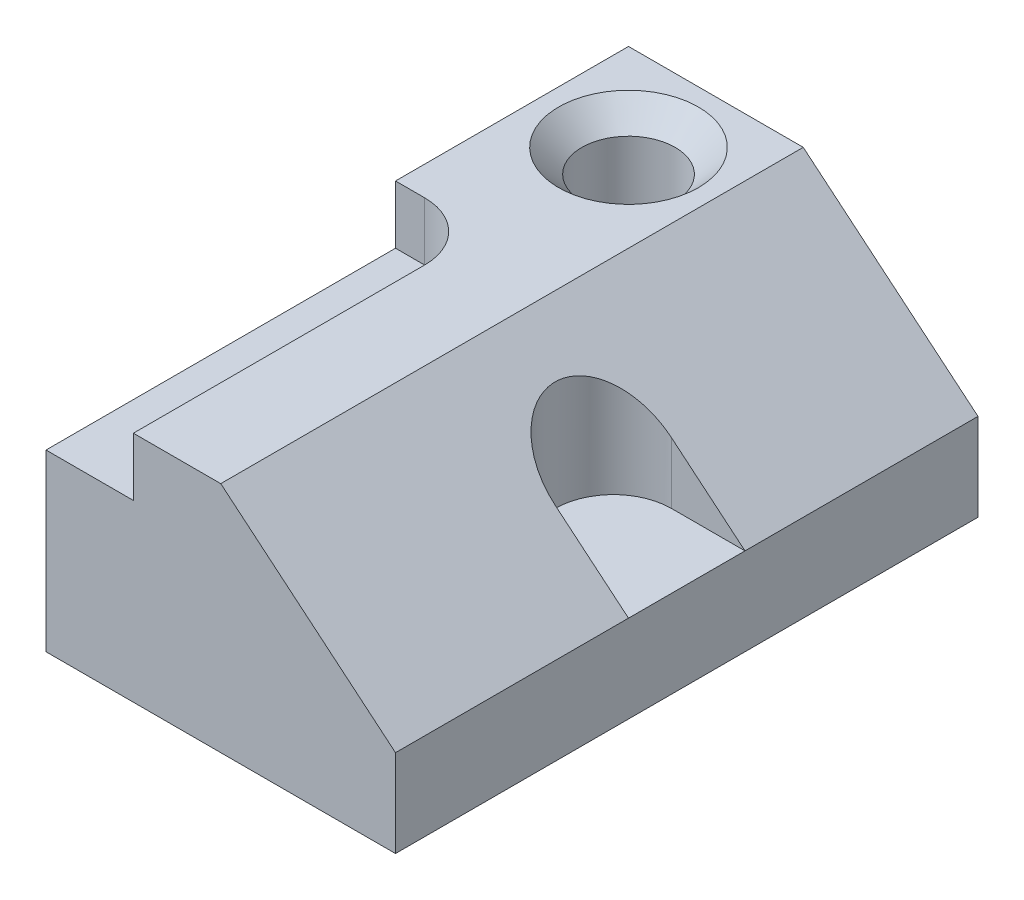
ISO-10303-21;
HEADER;
FILE_DESCRIPTION(('STEP AP214'),'2;1');
FILE_NAME('part.step','',(''),(''),'','','');
FILE_SCHEMA(('AUTOMOTIVE_DESIGN { 1 0 10303 214 1 1 1 1 }'));
ENDSEC;
DATA;
#1=APPLICATION_CONTEXT('core data for automotive mechanical design processes');
#2=APPLICATION_PROTOCOL_DEFINITION('international standard','automotive_design',2000,#1);
#3=PRODUCT_CONTEXT('',#1,'mechanical');
#4=PRODUCT('Part','Part','',(#3));
#5=PRODUCT_RELATED_PRODUCT_CATEGORY('part','',(#4));
#6=PRODUCT_DEFINITION_FORMATION('','',#4);
#7=PRODUCT_DEFINITION_CONTEXT('part definition',#1,'design');
#8=PRODUCT_DEFINITION('design','',#6,#7);
#9=PRODUCT_DEFINITION_SHAPE('','',#8);
#10=(LENGTH_UNIT() NAMED_UNIT(*) SI_UNIT(.MILLI.,.METRE.));
#11=(NAMED_UNIT(*) PLANE_ANGLE_UNIT() SI_UNIT($,.RADIAN.));
#12=(NAMED_UNIT(*) SI_UNIT($,.STERADIAN.) SOLID_ANGLE_UNIT());
#13=UNCERTAINTY_MEASURE_WITH_UNIT(LENGTH_MEASURE(1.E-05),#10,'distance_accuracy_value','');
#14=(GEOMETRIC_REPRESENTATION_CONTEXT(3) GLOBAL_UNCERTAINTY_ASSIGNED_CONTEXT((#13)) GLOBAL_UNIT_ASSIGNED_CONTEXT((#10,
#11,#12)) REPRESENTATION_CONTEXT('',''));
#15=CARTESIAN_POINT('',(0.,0.,0.));
#16=DIRECTION('',(0.,0.,1.));
#17=DIRECTION('',(1.,0.,0.));
#18=AXIS2_PLACEMENT_3D('',#15,#16,#17);
#19=CARTESIAN_POINT('',(6.35,38.1,63.5));
#20=DIRECTION('',(0.,-1.,0.));
#21=DIRECTION('',(1.,0.,0.));
#22=AXIS2_PLACEMENT_3D('',#19,#20,#21);
#23=CYLINDRICAL_SURFACE('',#22,12.7);
#24=DIRECTION('',(0.,1.,0.));
#25=VECTOR('',#24,1.);
#26=CARTESIAN_POINT('',(6.35,38.1,50.8));
#27=LINE('',#26,#25);
#28=CARTESIAN_POINT('',(6.35,38.1,50.8));
#29=VERTEX_POINT('',#28);
#30=CARTESIAN_POINT('',(6.35,50.8,50.8));
#31=VERTEX_POINT('',#30);
#32=EDGE_CURVE('E223',#29,#31,#27,.T.);
#33=ORIENTED_EDGE('',*,*,#32,.F.);
#34=CARTESIAN_POINT('',(6.35,38.1,63.5));
#35=DIRECTION('',(0.,-1.,0.));
#36=DIRECTION('',(1.,0.,0.));
#37=AXIS2_PLACEMENT_3D('',#34,#35,#36);
#38=CIRCLE('',#37,12.7);
#39=CARTESIAN_POINT('',(19.05,38.1,63.5));
#40=VERTEX_POINT('',#39);
#41=EDGE_CURVE('E89',#40,#29,#38,.F.);
#42=ORIENTED_EDGE('',*,*,#41,.F.);
#43=DIRECTION('',(0.,1.,0.));
#44=VECTOR('',#43,1.);
#45=CARTESIAN_POINT('',(19.05,38.1,63.5));
#46=LINE('',#45,#44);
#47=CARTESIAN_POINT('',(19.05,50.8,63.5));
#48=VERTEX_POINT('',#47);
#49=EDGE_CURVE('E227',#48,#40,#46,.F.);
#50=ORIENTED_EDGE('',*,*,#49,.F.);
#51=CARTESIAN_POINT('',(6.35,50.8,63.5));
#52=DIRECTION('',(0.,-1.,0.));
#53=DIRECTION('',(1.,0.,0.));
#54=AXIS2_PLACEMENT_3D('',#51,#52,#53);
#55=CIRCLE('',#54,12.7);
#56=EDGE_CURVE('E182',#48,#31,#55,.F.);
#57=ORIENTED_EDGE('',*,*,#56,.T.);
#58=EDGE_LOOP('',(#33,#42,#50,#57));
#59=FACE_BOUND('',#58,.T.);
#60=ADVANCED_FACE('F66',(#59),#23,.F.);
#61=CARTESIAN_POINT('',(0.,50.8,127.));
#62=DIRECTION('',(1.,0.,0.));
#63=DIRECTION('',(0.,1.,0.));
#64=AXIS2_PLACEMENT_3D('',#61,#62,#63);
#65=PLANE('',#64);
#66=DIRECTION('',(0.,0.,1.));
#67=VECTOR('',#66,1.);
#68=CARTESIAN_POINT('',(0.,38.1,127.));
#69=LINE('',#68,#67);
#70=CARTESIAN_POINT('',(0.,38.1,50.8));
#71=VERTEX_POINT('',#70);
#72=CARTESIAN_POINT('',(0.,38.1,127.));
#73=VERTEX_POINT('',#72);
#74=EDGE_CURVE('E249',#71,#73,#69,.T.);
#75=ORIENTED_EDGE('',*,*,#74,.F.);
#76=DIRECTION('',(0.,1.,0.));
#77=VECTOR('',#76,1.);
#78=CARTESIAN_POINT('',(0.,38.1,50.8));
#79=LINE('',#78,#77);
#80=CARTESIAN_POINT('',(0.,50.8,50.8));
#81=VERTEX_POINT('',#80);
#82=EDGE_CURVE('E260',#71,#81,#79,.T.);
#83=ORIENTED_EDGE('',*,*,#82,.T.);
#84=DIRECTION('',(0.,0.,-1.));
#85=VECTOR('',#84,1.);
#86=CARTESIAN_POINT('',(0.,50.8,127.));
#87=LINE('',#86,#85);
#88=CARTESIAN_POINT('',(0.,50.8,0.));
#89=VERTEX_POINT('',#88);
#90=EDGE_CURVE('E197',#81,#89,#87,.T.);
#91=ORIENTED_EDGE('',*,*,#90,.T.);
#92=DIRECTION('',(0.,-1.,0.));
#93=VECTOR('',#92,1.);
#94=CARTESIAN_POINT('',(0.,50.8,0.));
#95=LINE('',#94,#93);
#96=CARTESIAN_POINT('',(0.,0.,0.));
#97=VERTEX_POINT('',#96);
#98=EDGE_CURVE('E263',#89,#97,#95,.T.);
#99=ORIENTED_EDGE('',*,*,#98,.T.);
#100=DIRECTION('',(0.,0.,-1.));
#101=VECTOR('',#100,1.);
#102=CARTESIAN_POINT('',(0.,0.,127.));
#103=LINE('',#102,#101);
#104=CARTESIAN_POINT('',(0.,0.,127.));
#105=VERTEX_POINT('',#104);
#106=EDGE_CURVE('E203',#105,#97,#103,.T.);
#107=ORIENTED_EDGE('',*,*,#106,.F.);
#108=DIRECTION('',(0.,-1.,0.));
#109=VECTOR('',#108,1.);
#110=CARTESIAN_POINT('',(0.,50.8,127.));
#111=LINE('',#110,#109);
#112=EDGE_CURVE('E267',#73,#105,#111,.T.);
#113=ORIENTED_EDGE('',*,*,#112,.F.);
#114=EDGE_LOOP('',(#75,#83,#91,#99,#107,#113));
#115=FACE_BOUND('',#114,.T.);
#116=ADVANCED_FACE('F299',(#115),#65,.F.);
#117=CARTESIAN_POINT('',(0.,0.,127.));
#118=DIRECTION('',(0.,1.,0.));
#119=DIRECTION('',(0.,0.,1.));
#120=AXIS2_PLACEMENT_3D('',#117,#118,#119);
#121=PLANE('',#120);
#122=CARTESIAN_POINT('',(19.05,0.,19.05));
#123=DIRECTION('',(0.,1.,0.));
#124=DIRECTION('',(0.,0.,1.));
#125=AXIS2_PLACEMENT_3D('',#122,#123,#124);
#126=CIRCLE('',#125,15.2399999999999);
#127=CARTESIAN_POINT('',(19.05,0.,3.81000000000007));
#128=VERTEX_POINT('',#127);
#129=EDGE_CURVE('E207',#128,#128,#126,.T.);
#130=ORIENTED_EDGE('',*,*,#129,.T.);
#131=EDGE_LOOP('',(#130));
#132=FACE_BOUND('',#131,.T.);
#133=DIRECTION('',(1.,0.,0.));
#134=VECTOR('',#133,1.);
#135=CARTESIAN_POINT('',(0.,0.,0.));
#136=LINE('',#135,#134);
#137=CARTESIAN_POINT('',(76.2,0.,0.));
#138=VERTEX_POINT('',#137);
#139=EDGE_CURVE('E287',#97,#138,#136,.T.);
#140=ORIENTED_EDGE('',*,*,#139,.T.);
#141=DIRECTION('',(0.,0.,-1.));
#142=VECTOR('',#141,1.);
#143=CARTESIAN_POINT('',(76.2,0.,127.));
#144=LINE('',#143,#142);
#145=CARTESIAN_POINT('',(76.2,0.,127.));
#146=VERTEX_POINT('',#145);
#147=EDGE_CURVE('E195',#146,#138,#144,.T.);
#148=ORIENTED_EDGE('',*,*,#147,.F.);
#149=DIRECTION('',(1.,0.,0.));
#150=VECTOR('',#149,1.);
#151=CARTESIAN_POINT('',(0.,0.,127.));
#152=LINE('',#151,#150);
#153=EDGE_CURVE('E270',#105,#146,#152,.T.);
#154=ORIENTED_EDGE('',*,*,#153,.F.);
#155=ORIENTED_EDGE('',*,*,#106,.T.);
#156=EDGE_LOOP('',(#140,#148,#154,#155));
#157=FACE_BOUND('',#156,.T.);
#158=ADVANCED_FACE('F310',(#132,#157),#121,.F.);
#159=CARTESIAN_POINT('',(76.2,0.,127.));
#160=DIRECTION('',(-1.,0.,0.));
#161=DIRECTION('',(0.,0.,1.));
#162=AXIS2_PLACEMENT_3D('',#159,#160,#161);
#163=PLANE('',#162);
#164=DIRECTION('',(0.,1.,0.));
#165=VECTOR('',#164,1.);
#166=CARTESIAN_POINT('',(76.2,0.,0.));
#167=LINE('',#166,#165);
#168=CARTESIAN_POINT('',(76.2,19.05,0.));
#169=VERTEX_POINT('',#168);
#170=EDGE_CURVE('E187',#138,#169,#167,.T.);
#171=ORIENTED_EDGE('',*,*,#170,.T.);
#172=DIRECTION('',(0.,0.,-1.));
#173=VECTOR('',#172,1.);
#174=CARTESIAN_POINT('',(76.2,19.05,127.));
#175=LINE('',#174,#173);
#176=CARTESIAN_POINT('',(76.2,19.05,50.8));
#177=VERTEX_POINT('',#176);
#178=EDGE_CURVE('E179',#177,#169,#175,.T.);
#179=ORIENTED_EDGE('',*,*,#178,.F.);
#180=DIRECTION('',(0.,0.,-1.));
#181=VECTOR('',#180,1.);
#182=CARTESIAN_POINT('',(76.2,19.05,50.8));
#183=LINE('',#182,#181);
#184=CARTESIAN_POINT('',(76.2,19.05,76.2));
#185=VERTEX_POINT('',#184);
#186=EDGE_CURVE('E166',#185,#177,#183,.T.);
#187=ORIENTED_EDGE('',*,*,#186,.F.);
#188=CARTESIAN_POINT('',(76.2,19.05,127.));
#189=VERTEX_POINT('',#188);
#190=EDGE_CURVE('E190',#189,#185,#175,.T.);
#191=ORIENTED_EDGE('',*,*,#190,.F.);
#192=DIRECTION('',(0.,1.,0.));
#193=VECTOR('',#192,1.);
#194=CARTESIAN_POINT('',(76.2,0.,127.));
#195=LINE('',#194,#193);
#196=EDGE_CURVE('E274',#146,#189,#195,.T.);
#197=ORIENTED_EDGE('',*,*,#196,.F.);
#198=ORIENTED_EDGE('',*,*,#147,.T.);
#199=EDGE_LOOP('',(#171,#179,#187,#191,#197,#198));
#200=FACE_BOUND('',#199,.T.);
#201=ADVANCED_FACE('F184',(#200),#163,.F.);
#202=CARTESIAN_POINT('',(76.2,19.05,127.));
#203=DIRECTION('',(-0.64018439966448,-0.768221279597376,0.));
#204=DIRECTION('',(0.768221279597376,-0.64018439966448,0.));
#205=AXIS2_PLACEMENT_3D('',#202,#203,#204);
#206=PLANE('',#205);
#207=ORIENTED_EDGE('',*,*,#190,.T.);
#208=DIRECTION('',(-0.768221279597376,0.64018439966448,0.));
#209=VECTOR('',#208,1.);
#210=CARTESIAN_POINT('',(76.2,19.05,76.2));
#211=LINE('',#210,#209);
#212=CARTESIAN_POINT('',(60.198,32.385,76.2));
#213=VERTEX_POINT('',#212);
#214=EDGE_CURVE('E12',#185,#213,#211,.T.);
#215=ORIENTED_EDGE('',*,*,#214,.T.);
#216=CARTESIAN_POINT('',(60.198,32.385,63.5));
#217=DIRECTION('',(-0.64018439966448,-0.768221279597376,0.));
#218=DIRECTION('',(-0.768221279597376,0.64018439966448,0.));
#219=AXIS2_PLACEMENT_3D('',#216,#217,#218);
#220=ELLIPSE('',#219,16.5316951473357,12.7);
#221=CARTESIAN_POINT('',(60.198,32.385,50.8));
#222=VERTEX_POINT('',#221);
#223=EDGE_CURVE('E74',#213,#222,#220,.T.);
#224=ORIENTED_EDGE('',*,*,#223,.T.);
#225=DIRECTION('',(0.768221279597376,-0.64018439966448,0.));
#226=VECTOR('',#225,1.);
#227=CARTESIAN_POINT('',(76.2,19.05,50.8));
#228=LINE('',#227,#226);
#229=EDGE_CURVE('E160',#222,#177,#228,.T.);
#230=ORIENTED_EDGE('',*,*,#229,.T.);
#231=ORIENTED_EDGE('',*,*,#178,.T.);
#232=DIRECTION('',(-0.768221279597376,0.64018439966448,0.));
#233=VECTOR('',#232,1.);
#234=CARTESIAN_POINT('',(76.2,19.05,0.));
#235=LINE('',#234,#233);
#236=CARTESIAN_POINT('',(38.1,50.8,0.));
#237=VERTEX_POINT('',#236);
#238=EDGE_CURVE('E292',#169,#237,#235,.T.);
#239=ORIENTED_EDGE('',*,*,#238,.T.);
#240=DIRECTION('',(0.,0.,-1.));
#241=VECTOR('',#240,1.);
#242=CARTESIAN_POINT('',(38.1,50.8,127.));
#243=LINE('',#242,#241);
#244=CARTESIAN_POINT('',(38.1,50.8,127.));
#245=VERTEX_POINT('',#244);
#246=EDGE_CURVE('E191',#245,#237,#243,.T.);
#247=ORIENTED_EDGE('',*,*,#246,.F.);
#248=DIRECTION('',(-0.768221279597376,0.64018439966448,0.));
#249=VECTOR('',#248,1.);
#250=CARTESIAN_POINT('',(76.2,19.05,127.));
#251=LINE('',#250,#249);
#252=EDGE_CURVE('E277',#189,#245,#251,.T.);
#253=ORIENTED_EDGE('',*,*,#252,.F.);
#254=EDGE_LOOP('',(#207,#215,#224,#230,#231,#239,#247,#253));
#255=FACE_BOUND('',#254,.T.);
#256=ADVANCED_FACE('F178',(#255),#206,.F.);
#257=CARTESIAN_POINT('',(38.1,50.8,127.));
#258=DIRECTION('',(0.,-1.,0.));
#259=DIRECTION('',(1.,0.,0.));
#260=AXIS2_PLACEMENT_3D('',#257,#258,#259);
#261=PLANE('',#260);
#262=CARTESIAN_POINT('',(19.05,50.8,19.05));
#263=DIRECTION('',(0.,-1.,0.));
#264=DIRECTION('',(1.,0.,0.));
#265=AXIS2_PLACEMENT_3D('',#262,#263,#264);
#266=CIRCLE('',#265,15.2400000000001);
#267=CARTESIAN_POINT('',(34.2900000000001,50.8,19.05));
#268=VERTEX_POINT('',#267);
#269=EDGE_CURVE('E219',#268,#268,#266,.T.);
#270=ORIENTED_EDGE('',*,*,#269,.T.);
#271=EDGE_LOOP('',(#270));
#272=FACE_BOUND('',#271,.T.);
#273=ORIENTED_EDGE('',*,*,#90,.F.);
#274=DIRECTION('',(-1.,0.,0.));
#275=VECTOR('',#274,1.);
#276=CARTESIAN_POINT('',(0.,50.8,50.8));
#277=LINE('',#276,#275);
#278=EDGE_CURVE('E242',#31,#81,#277,.T.);
#279=ORIENTED_EDGE('',*,*,#278,.F.);
#280=ORIENTED_EDGE('',*,*,#56,.F.);
#281=DIRECTION('',(0.,0.,-1.));
#282=VECTOR('',#281,1.);
#283=CARTESIAN_POINT('',(19.05,50.8,127.));
#284=LINE('',#283,#282);
#285=CARTESIAN_POINT('',(19.05,50.8,127.));
#286=VERTEX_POINT('',#285);
#287=EDGE_CURVE('E250',#286,#48,#284,.T.);
#288=ORIENTED_EDGE('',*,*,#287,.F.);
#289=DIRECTION('',(-1.,0.,0.));
#290=VECTOR('',#289,1.);
#291=CARTESIAN_POINT('',(38.1,50.8,127.));
#292=LINE('',#291,#290);
#293=EDGE_CURVE('E280',#245,#286,#292,.T.);
#294=ORIENTED_EDGE('',*,*,#293,.F.);
#295=ORIENTED_EDGE('',*,*,#246,.T.);
#296=DIRECTION('',(-1.,0.,0.));
#297=VECTOR('',#296,1.);
#298=CARTESIAN_POINT('',(38.1,50.8,0.));
#299=LINE('',#298,#297);
#300=EDGE_CURVE('E271',#237,#89,#299,.T.);
#301=ORIENTED_EDGE('',*,*,#300,.T.);
#302=EDGE_LOOP('',(#273,#279,#280,#288,#294,#295,#301));
#303=FACE_BOUND('',#302,.T.);
#304=ADVANCED_FACE('F246',(#272,#303),#261,.F.);
#305=CARTESIAN_POINT('',(0.,0.,127.));
#306=DIRECTION('',(0.,0.,1.));
#307=DIRECTION('',(1.,0.,0.));
#308=AXIS2_PLACEMENT_3D('',#305,#306,#307);
#309=PLANE('',#308);
#310=DIRECTION('',(0.,1.,0.));
#311=VECTOR('',#310,1.);
#312=CARTESIAN_POINT('',(19.05,38.1,127.));
#313=LINE('',#312,#311);
#314=CARTESIAN_POINT('',(19.05,38.1,127.));
#315=VERTEX_POINT('',#314);
#316=EDGE_CURVE('E264',#315,#286,#313,.T.);
#317=ORIENTED_EDGE('',*,*,#316,.F.);
#318=DIRECTION('',(1.,0.,0.));
#319=VECTOR('',#318,1.);
#320=CARTESIAN_POINT('',(0.,38.1,127.));
#321=LINE('',#320,#319);
#322=EDGE_CURVE('E254',#73,#315,#321,.T.);
#323=ORIENTED_EDGE('',*,*,#322,.F.);
#324=ORIENTED_EDGE('',*,*,#112,.T.);
#325=ORIENTED_EDGE('',*,*,#153,.T.);
#326=ORIENTED_EDGE('',*,*,#196,.T.);
#327=ORIENTED_EDGE('',*,*,#252,.T.);
#328=ORIENTED_EDGE('',*,*,#293,.T.);
#329=EDGE_LOOP('',(#317,#323,#324,#325,#326,#327,#328));
#330=FACE_BOUND('',#329,.T.);
#331=ADVANCED_FACE('F315',(#330),#309,.T.);
#332=CARTESIAN_POINT('',(0.,0.,0.));
#333=DIRECTION('',(0.,0.,1.));
#334=DIRECTION('',(1.,0.,0.));
#335=AXIS2_PLACEMENT_3D('',#332,#333,#334);
#336=PLANE('',#335);
#337=ORIENTED_EDGE('',*,*,#98,.F.);
#338=ORIENTED_EDGE('',*,*,#300,.F.);
#339=ORIENTED_EDGE('',*,*,#238,.F.);
#340=ORIENTED_EDGE('',*,*,#170,.F.);
#341=ORIENTED_EDGE('',*,*,#139,.F.);
#342=EDGE_LOOP('',(#337,#338,#339,#340,#341));
#343=FACE_BOUND('',#342,.T.);
#344=ADVANCED_FACE('F306',(#343),#336,.F.);
#345=CARTESIAN_POINT('',(19.05,50.8,19.05));
#346=DIRECTION('',(0.,-1.,0.));
#347=DIRECTION('',(0.,0.,-1.));
#348=AXIS2_PLACEMENT_3D('',#345,#346,#347);
#349=CYLINDRICAL_SURFACE('',#348,10.16);
#350=CARTESIAN_POINT('',(19.05,5.07999999999996,19.05));
#351=DIRECTION('',(0.,1.,0.));
#352=DIRECTION('',(0.,0.,1.));
#353=AXIS2_PLACEMENT_3D('',#350,#351,#352);
#354=CIRCLE('',#353,10.16);
#355=CARTESIAN_POINT('',(19.05,5.07999999999996,8.89));
#356=VERTEX_POINT('',#355);
#357=EDGE_CURVE('E215',#356,#356,#354,.F.);
#358=CARTESIAN_POINT('',(19.05,45.7199999999999,19.05));
#359=DIRECTION('',(0.,-1.,0.));
#360=DIRECTION('',(0.,0.,-1.));
#361=AXIS2_PLACEMENT_3D('',#358,#359,#360);
#362=CIRCLE('',#361,10.16);
#363=CARTESIAN_POINT('',(19.05,45.7199999999999,8.89));
#364=VERTEX_POINT('',#363);
#365=EDGE_CURVE('E211',#364,#364,#362,.F.);
#366=CARTESIAN_POINT('',(19.05,5.07999999999996,8.89));
#367=CARTESIAN_POINT('',(19.05,5.50333333333329,8.89));
#368=CARTESIAN_POINT('',(19.05,5.92666666666663,8.89));
#369=CARTESIAN_POINT('',(19.05,6.77333333333329,8.89));
#370=CARTESIAN_POINT('',(19.05,7.19666666666663,8.89));
#371=CARTESIAN_POINT('',(19.05,8.04333333333329,8.89));
#372=CARTESIAN_POINT('',(19.05,8.46666666666663,8.89));
#373=CARTESIAN_POINT('',(19.05,9.31333333333329,8.89));
#374=CARTESIAN_POINT('',(19.05,9.73666666666663,8.89));
#375=CARTESIAN_POINT('',(19.05,10.5833333333333,8.89));
#376=CARTESIAN_POINT('',(19.05,11.0066666666666,8.89));
#377=CARTESIAN_POINT('',(19.05,11.8533333333333,8.89));
#378=CARTESIAN_POINT('',(19.05,12.2766666666666,8.89));
#379=CARTESIAN_POINT('',(19.05,13.1233333333333,8.89));
#380=CARTESIAN_POINT('',(19.05,13.5466666666666,8.89));
#381=CARTESIAN_POINT('',(19.05,14.3933333333333,8.89));
#382=CARTESIAN_POINT('',(19.05,14.8166666666666,8.89));
#383=CARTESIAN_POINT('',(19.05,15.6633333333333,8.89));
#384=CARTESIAN_POINT('',(19.05,16.0866666666666,8.89));
#385=CARTESIAN_POINT('',(19.05,16.9333333333333,8.89));
#386=CARTESIAN_POINT('',(19.05,17.3566666666666,8.89));
#387=CARTESIAN_POINT('',(19.05,18.2033333333333,8.89));
#388=CARTESIAN_POINT('',(19.05,18.6266666666666,8.89));
#389=CARTESIAN_POINT('',(19.05,19.4733333333333,8.89));
#390=CARTESIAN_POINT('',(19.05,19.8966666666666,8.89));
#391=CARTESIAN_POINT('',(19.05,20.7433333333333,8.89));
#392=CARTESIAN_POINT('',(19.05,21.1666666666666,8.89));
#393=CARTESIAN_POINT('',(19.05,22.0133333333333,8.89));
#394=CARTESIAN_POINT('',(19.05,22.4366666666666,8.89));
#395=CARTESIAN_POINT('',(19.05,23.2833333333333,8.89));
#396=CARTESIAN_POINT('',(19.05,23.7066666666666,8.89));
#397=CARTESIAN_POINT('',(19.05,24.5533333333333,8.89));
#398=CARTESIAN_POINT('',(19.05,24.9766666666666,8.89));
#399=CARTESIAN_POINT('',(19.05,25.8233333333333,8.89));
#400=CARTESIAN_POINT('',(19.05,26.2466666666666,8.89));
#401=CARTESIAN_POINT('',(19.05,27.0933333333333,8.89));
#402=CARTESIAN_POINT('',(19.05,27.5166666666666,8.89));
#403=CARTESIAN_POINT('',(19.05,28.3633333333333,8.89));
#404=CARTESIAN_POINT('',(19.05,28.7866666666666,8.89));
#405=CARTESIAN_POINT('',(19.05,29.6333333333333,8.89));
#406=CARTESIAN_POINT('',(19.05,30.0566666666666,8.89));
#407=CARTESIAN_POINT('',(19.05,30.9033333333333,8.89));
#408=CARTESIAN_POINT('',(19.05,31.3266666666666,8.89));
#409=CARTESIAN_POINT('',(19.05,32.1733333333333,8.89));
#410=CARTESIAN_POINT('',(19.05,32.5966666666666,8.89));
#411=CARTESIAN_POINT('',(19.05,33.4433333333333,8.89));
#412=CARTESIAN_POINT('',(19.05,33.8666666666666,8.89));
#413=CARTESIAN_POINT('',(19.05,34.7133333333333,8.89));
#414=CARTESIAN_POINT('',(19.05,35.1366666666666,8.89));
#415=CARTESIAN_POINT('',(19.05,35.9833333333333,8.89));
#416=CARTESIAN_POINT('',(19.05,36.4066666666666,8.89));
#417=CARTESIAN_POINT('',(19.05,37.2533333333333,8.89));
#418=CARTESIAN_POINT('',(19.05,37.6766666666666,8.89));
#419=CARTESIAN_POINT('',(19.05,38.5233333333333,8.89));
#420=CARTESIAN_POINT('',(19.05,38.9466666666666,8.89));
#421=CARTESIAN_POINT('',(19.05,39.7933333333333,8.89));
#422=CARTESIAN_POINT('',(19.05,40.2166666666666,8.89));
#423=CARTESIAN_POINT('',(19.05,41.0633333333333,8.89));
#424=CARTESIAN_POINT('',(19.05,41.4866666666666,8.89));
#425=CARTESIAN_POINT('',(19.05,42.3333333333333,8.89));
#426=CARTESIAN_POINT('',(19.05,42.7566666666666,8.89));
#427=CARTESIAN_POINT('',(19.05,43.6033333333333,8.89));
#428=CARTESIAN_POINT('',(19.05,44.0266666666666,8.89));
#429=CARTESIAN_POINT('',(19.05,44.8733333333333,8.89));
#430=CARTESIAN_POINT('',(19.05,45.2966666666666,8.89));
#431=CARTESIAN_POINT('',(19.05,45.7199999999999,8.89));
#432=B_SPLINE_CURVE_WITH_KNOTS('',3,(#366,#367,#368,#369,#370,#371,#372,#373,#374,#375,#376,
#377,#378,#379,#380,#381,#382,#383,#384,#385,#386,#387,#388,#389,#390,#391,#392,#393,#394,#395,
#396,#397,#398,#399,#400,#401,#402,#403,#404,#405,#406,#407,#408,#409,#410,#411,#412,#413,#414,
#415,#416,#417,#418,#419,#420,#421,#422,#423,#424,#425,#426,#427,#428,#429,#430,#431),
.UNSPECIFIED.,.F.,.F.,(4,2,2,2,2,2,2,2,2,2,2,2,2,2,2,2,2,2,2,2,2,2,2,2,2,2,2,2,2,2,2,2,4),(0.,
1.27,2.54,3.81,5.08,6.34999999999999,7.61999999999999,8.89,10.16,11.43,12.7,13.97,15.24,16.51,
17.78,19.05,20.32,21.59,22.86,24.13,25.4,26.67,27.94,29.21,30.48,31.75,33.02,34.29,35.56,36.83,
38.1,39.37,40.64),.UNSPECIFIED.);
#433=EDGE_CURVE('BSEAM373',#356,#364,#432,.T.);
#434=ORIENTED_EDGE('',*,*,#357,.T.);
#435=ORIENTED_EDGE('',*,*,#365,.T.);
#436=ORIENTED_EDGE('',*,*,#433,.T.);
#437=ORIENTED_EDGE('',*,*,#433,.F.);
#438=EDGE_LOOP('',(#434,#436,#435,#437));
#439=FACE_BOUND('',#438,.T.);
#440=ADVANCED_FACE('F373',(#439),#349,.F.);
#441=CARTESIAN_POINT('',(19.05,0.,19.05));
#442=DIRECTION('',(0.,-1.,0.));
#443=DIRECTION('',(0.,0.,-1.));
#444=AXIS2_PLACEMENT_3D('',#441,#442,#443);
#445=CONICAL_SURFACE('',#444,15.2399999999999,0.785398163397446);
#446=CARTESIAN_POINT('',(19.05,5.07999999999996,8.89000000000001));
#447=CARTESIAN_POINT('',(19.05,5.02708333333329,8.83708333333334));
#448=CARTESIAN_POINT('',(19.05,4.97416666666663,8.78416666666668));
#449=CARTESIAN_POINT('',(19.05,4.86833333333329,8.67833333333334));
#450=CARTESIAN_POINT('',(19.05,4.81541666666663,8.62541666666668));
#451=CARTESIAN_POINT('',(19.05,4.70958333333329,8.51958333333335));
#452=CARTESIAN_POINT('',(19.05,4.65666666666663,8.46666666666668));
#453=CARTESIAN_POINT('',(19.05,4.5508333333333,8.36083333333335));
#454=CARTESIAN_POINT('',(19.05,4.49791666666663,8.30791666666668));
#455=CARTESIAN_POINT('',(19.05,4.3920833333333,8.20208333333335));
#456=CARTESIAN_POINT('',(19.05,4.33916666666663,8.14916666666669));
#457=CARTESIAN_POINT('',(19.05,4.2333333333333,8.04333333333335));
#458=CARTESIAN_POINT('',(19.05,4.18041666666663,7.99041666666669));
#459=CARTESIAN_POINT('',(19.05,4.0745833333333,7.88458333333335));
#460=CARTESIAN_POINT('',(19.05,4.02166666666663,7.83166666666669));
#461=CARTESIAN_POINT('',(19.05,3.9158333333333,7.72583333333336));
#462=CARTESIAN_POINT('',(19.05,3.86291666666664,7.67291666666669));
#463=CARTESIAN_POINT('',(19.05,3.7570833333333,7.56708333333336));
#464=CARTESIAN_POINT('',(19.05,3.70416666666664,7.51416666666669));
#465=CARTESIAN_POINT('',(19.05,3.5983333333333,7.40833333333336));
#466=CARTESIAN_POINT('',(19.05,3.54541666666664,7.35541666666669));
#467=CARTESIAN_POINT('',(19.05,3.43958333333331,7.24958333333336));
#468=CARTESIAN_POINT('',(19.05,3.38666666666664,7.1966666666667));
#469=CARTESIAN_POINT('',(19.05,3.28083333333331,7.09083333333336));
#470=CARTESIAN_POINT('',(19.05,3.22791666666664,7.0379166666667));
#471=CARTESIAN_POINT('',(19.05,3.12208333333331,6.93208333333337));
#472=CARTESIAN_POINT('',(19.05,3.06916666666664,6.8791666666667));
#473=CARTESIAN_POINT('',(19.05,2.96333333333331,6.77333333333337));
#474=CARTESIAN_POINT('',(19.05,2.91041666666664,6.7204166666667));
#475=CARTESIAN_POINT('',(19.05,2.80458333333331,6.61458333333337));
#476=CARTESIAN_POINT('',(19.05,2.75166666666664,6.56166666666671));
#477=CARTESIAN_POINT('',(19.05,2.64583333333331,6.45583333333337));
#478=CARTESIAN_POINT('',(19.05,2.59291666666665,6.40291666666671));
#479=CARTESIAN_POINT('',(19.05,2.48708333333331,6.29708333333337));
#480=CARTESIAN_POINT('',(19.05,2.43416666666665,6.24416666666671));
#481=CARTESIAN_POINT('',(19.05,2.32833333333331,6.13833333333338));
#482=CARTESIAN_POINT('',(19.05,2.27541666666665,6.08541666666671));
#483=CARTESIAN_POINT('',(19.05,2.16958333333332,5.97958333333338));
#484=CARTESIAN_POINT('',(19.05,2.11666666666665,5.92666666666671));
#485=CARTESIAN_POINT('',(19.05,2.01083333333332,5.82083333333338));
#486=CARTESIAN_POINT('',(19.05,1.95791666666665,5.76791666666671));
#487=CARTESIAN_POINT('',(19.05,1.85208333333332,5.66208333333338));
#488=CARTESIAN_POINT('',(19.05,1.79916666666665,5.60916666666672));
#489=CARTESIAN_POINT('',(19.05,1.69333333333332,5.50333333333338));
#490=CARTESIAN_POINT('',(19.05,1.64041666666665,5.45041666666672));
#491=CARTESIAN_POINT('',(19.05,1.53458333333332,5.34458333333338));
#492=CARTESIAN_POINT('',(19.05,1.48166666666665,5.29166666666672));
#493=CARTESIAN_POINT('',(19.05,1.37583333333332,5.18583333333339));
#494=CARTESIAN_POINT('',(19.05,1.32291666666666,5.13291666666672));
#495=CARTESIAN_POINT('',(19.05,1.21708333333332,5.02708333333339));
#496=CARTESIAN_POINT('',(19.05,1.16416666666666,4.97416666666672));
#497=CARTESIAN_POINT('',(19.05,1.05833333333332,4.86833333333339));
#498=CARTESIAN_POINT('',(19.05,1.00541666666666,4.81541666666673));
#499=CARTESIAN_POINT('',(19.05,0.899583333333326,4.70958333333339));
#500=CARTESIAN_POINT('',(19.05,0.84666666666666,4.65666666666673));
#501=CARTESIAN_POINT('',(19.05,0.740833333333328,4.5508333333334));
#502=CARTESIAN_POINT('',(19.05,0.687916666666661,4.49791666666673));
#503=CARTESIAN_POINT('',(19.05,0.582083333333329,4.3920833333334));
#504=CARTESIAN_POINT('',(19.05,0.529166666666662,4.33916666666673));
#505=CARTESIAN_POINT('',(19.05,0.42333333333333,4.2333333333334));
#506=CARTESIAN_POINT('',(19.05,0.370416666666664,4.18041666666673));
#507=CARTESIAN_POINT('',(19.05,0.264583333333331,4.0745833333334));
#508=CARTESIAN_POINT('',(19.05,0.211666666666665,4.02166666666674));
#509=CARTESIAN_POINT('',(19.05,0.105833333333333,3.9158333333334));
#510=CARTESIAN_POINT('',(19.05,0.0529166666666663,3.86291666666674));
#511=CARTESIAN_POINT('',(19.05,0.,3.81000000000007));
#512=B_SPLINE_CURVE_WITH_KNOTS('',3,(#446,#447,#448,#449,#450,#451,#452,#453,#454,#455,#456,
#457,#458,#459,#460,#461,#462,#463,#464,#465,#466,#467,#468,#469,#470,#471,#472,#473,#474,#475,
#476,#477,#478,#479,#480,#481,#482,#483,#484,#485,#486,#487,#488,#489,#490,#491,#492,#493,#494,
#495,#496,#497,#498,#499,#500,#501,#502,#503,#504,#505,#506,#507,#508,#509,#510,#511),
.UNSPECIFIED.,.F.,.F.,(4,2,2,2,2,2,2,2,2,2,2,2,2,2,2,2,2,2,2,2,2,2,2,2,2,2,2,2,2,2,2,2,4),(0.,
0.224506403026728,0.449012806053453,0.673519209080179,0.898025612106907,1.12253201513363,
1.34703841816036,1.57154482118709,1.79605122421381,2.02055762724054,2.24506403026727,
2.46957043329399,2.69407683632072,2.91858323934745,3.14308964237417,3.3675960454009,
3.59210244842763,3.81660885145435,4.04111525448108,4.26562165750781,4.49012806053453,
4.71463446356126,4.93914086658799,5.16364726961471,5.38815367264144,5.61266007566817,
5.83716647869489,6.06167288172162,6.28617928474834,6.51068568777507,6.7351920908018,
6.95969849382852,7.18420489685525),.UNSPECIFIED.);
#513=EDGE_CURVE('BSEAM367',#356,#128,#512,.T.);
#514=ORIENTED_EDGE('',*,*,#357,.F.);
#515=ORIENTED_EDGE('',*,*,#129,.F.);
#516=ORIENTED_EDGE('',*,*,#513,.T.);
#517=ORIENTED_EDGE('',*,*,#513,.F.);
#518=EDGE_LOOP('',(#514,#516,#515,#517));
#519=FACE_BOUND('',#518,.T.);
#520=ADVANCED_FACE('F367',(#519),#445,.F.);
#521=CARTESIAN_POINT('',(19.05,45.7199999999999,19.05));
#522=DIRECTION('',(0.,1.,0.));
#523=DIRECTION('',(0.,0.,1.));
#524=AXIS2_PLACEMENT_3D('',#521,#522,#523);
#525=CONICAL_SURFACE('',#524,10.16,0.78539816339745);
#526=ORIENTED_EDGE('',*,*,#269,.F.);
#527=EDGE_LOOP('',(#526));
#528=FACE_BOUND('',#527,.T.);
#529=ORIENTED_EDGE('',*,*,#365,.F.);
#530=EDGE_LOOP('',(#529));
#531=FACE_BOUND('',#530,.T.);
#532=ADVANCED_FACE('F372',(#528,#531),#525,.F.);
#533=CARTESIAN_POINT('',(0.,38.1,50.8));
#534=DIRECTION('',(0.,0.,-1.));
#535=DIRECTION('',(-1.,0.,0.));
#536=AXIS2_PLACEMENT_3D('',#533,#534,#535);
#537=PLANE('',#536);
#538=DIRECTION('',(-1.,0.,0.));
#539=VECTOR('',#538,1.);
#540=CARTESIAN_POINT('',(0.,38.1,50.8));
#541=LINE('',#540,#539);
#542=EDGE_CURVE('E244',#29,#71,#541,.T.);
#543=ORIENTED_EDGE('',*,*,#542,.F.);
#544=ORIENTED_EDGE('',*,*,#32,.T.);
#545=ORIENTED_EDGE('',*,*,#278,.T.);
#546=ORIENTED_EDGE('',*,*,#82,.F.);
#547=EDGE_LOOP('',(#543,#544,#545,#546));
#548=FACE_BOUND('',#547,.T.);
#549=ADVANCED_FACE('F240',(#548),#537,.F.);
#550=CARTESIAN_POINT('',(19.05,38.1,127.));
#551=DIRECTION('',(1.,0.,0.));
#552=DIRECTION('',(0.,1.,0.));
#553=AXIS2_PLACEMENT_3D('',#550,#551,#552);
#554=PLANE('',#553);
#555=ORIENTED_EDGE('',*,*,#287,.T.);
#556=ORIENTED_EDGE('',*,*,#49,.T.);
#557=DIRECTION('',(0.,0.,-1.));
#558=VECTOR('',#557,1.);
#559=CARTESIAN_POINT('',(19.05,38.1,127.));
#560=LINE('',#559,#558);
#561=EDGE_CURVE('E320',#315,#40,#560,.T.);
#562=ORIENTED_EDGE('',*,*,#561,.F.);
#563=ORIENTED_EDGE('',*,*,#316,.T.);
#564=EDGE_LOOP('',(#555,#556,#562,#563));
#565=FACE_BOUND('',#564,.T.);
#566=ADVANCED_FACE('F328',(#565),#554,.F.);
#567=CARTESIAN_POINT('',(0.,38.1,0.));
#568=DIRECTION('',(0.,-1.,0.));
#569=DIRECTION('',(1.,0.,0.));
#570=AXIS2_PLACEMENT_3D('',#567,#568,#569);
#571=PLANE('',#570);
#572=ORIENTED_EDGE('',*,*,#561,.T.);
#573=ORIENTED_EDGE('',*,*,#41,.T.);
#574=ORIENTED_EDGE('',*,*,#542,.T.);
#575=ORIENTED_EDGE('',*,*,#74,.T.);
#576=ORIENTED_EDGE('',*,*,#322,.T.);
#577=EDGE_LOOP('',(#572,#573,#574,#575,#576));
#578=FACE_BOUND('',#577,.T.);
#579=ADVANCED_FACE('F326',(#578),#571,.F.);
#580=CARTESIAN_POINT('',(60.198,19.05,76.2));
#581=DIRECTION('',(0.,0.,1.));
#582=DIRECTION('',(1.,0.,0.));
#583=AXIS2_PLACEMENT_3D('',#580,#581,#582);
#584=PLANE('',#583);
#585=DIRECTION('',(1.,0.,0.));
#586=VECTOR('',#585,1.);
#587=CARTESIAN_POINT('',(60.198,19.05,76.2));
#588=LINE('',#587,#586);
#589=CARTESIAN_POINT('',(60.198,19.05,76.2));
#590=VERTEX_POINT('',#589);
#591=EDGE_CURVE('E81',#590,#185,#588,.T.);
#592=ORIENTED_EDGE('',*,*,#591,.F.);
#593=DIRECTION('',(0.,1.,0.));
#594=VECTOR('',#593,1.);
#595=CARTESIAN_POINT('',(60.198,19.05,76.2));
#596=LINE('',#595,#594);
#597=EDGE_CURVE('E256',#590,#213,#596,.T.);
#598=ORIENTED_EDGE('',*,*,#597,.T.);
#599=ORIENTED_EDGE('',*,*,#214,.F.);
#600=EDGE_LOOP('',(#592,#598,#599));
#601=FACE_BOUND('',#600,.T.);
#602=ADVANCED_FACE('F333',(#601),#584,.F.);
#603=CARTESIAN_POINT('',(60.198,19.05,63.5));
#604=DIRECTION('',(0.,1.,0.));
#605=DIRECTION('',(-1.,0.,0.));
#606=AXIS2_PLACEMENT_3D('',#603,#604,#605);
#607=CYLINDRICAL_SURFACE('',#606,12.7);
#608=ORIENTED_EDGE('',*,*,#597,.F.);
#609=CARTESIAN_POINT('',(60.198,19.05,63.5));
#610=DIRECTION('',(0.,1.,0.));
#611=DIRECTION('',(-1.,0.,0.));
#612=AXIS2_PLACEMENT_3D('',#609,#610,#611);
#613=CIRCLE('',#612,12.7);
#614=CARTESIAN_POINT('',(60.198,19.05,50.8));
#615=VERTEX_POINT('',#614);
#616=EDGE_CURVE('E165',#615,#590,#613,.T.);
#617=ORIENTED_EDGE('',*,*,#616,.F.);
#618=DIRECTION('',(0.,1.,0.));
#619=VECTOR('',#618,1.);
#620=CARTESIAN_POINT('',(60.198,19.05,50.8));
#621=LINE('',#620,#619);
#622=EDGE_CURVE('E162',#615,#222,#621,.T.);
#623=ORIENTED_EDGE('',*,*,#622,.T.);
#624=ORIENTED_EDGE('',*,*,#223,.F.);
#625=EDGE_LOOP('',(#608,#617,#623,#624));
#626=FACE_BOUND('',#625,.T.);
#627=ADVANCED_FACE('F342',(#626),#607,.F.);
#628=CARTESIAN_POINT('',(76.2,19.05,50.8));
#629=DIRECTION('',(0.,0.,-1.));
#630=DIRECTION('',(-1.,0.,0.));
#631=AXIS2_PLACEMENT_3D('',#628,#629,#630);
#632=PLANE('',#631);
#633=ORIENTED_EDGE('',*,*,#622,.F.);
#634=DIRECTION('',(-1.,0.,0.));
#635=VECTOR('',#634,1.);
#636=CARTESIAN_POINT('',(76.2,19.05,50.8));
#637=LINE('',#636,#635);
#638=EDGE_CURVE('E157',#177,#615,#637,.T.);
#639=ORIENTED_EDGE('',*,*,#638,.F.);
#640=ORIENTED_EDGE('',*,*,#229,.F.);
#641=EDGE_LOOP('',(#633,#639,#640));
#642=FACE_BOUND('',#641,.T.);
#643=ADVANCED_FACE('F158',(#642),#632,.F.);
#644=CARTESIAN_POINT('',(60.198,19.05,63.5));
#645=DIRECTION('',(0.,1.,0.));
#646=DIRECTION('',(-1.,0.,0.));
#647=AXIS2_PLACEMENT_3D('',#644,#645,#646);
#648=PLANE('',#647);
#649=ORIENTED_EDGE('',*,*,#186,.T.);
#650=ORIENTED_EDGE('',*,*,#638,.T.);
#651=ORIENTED_EDGE('',*,*,#616,.T.);
#652=ORIENTED_EDGE('',*,*,#591,.T.);
#653=EDGE_LOOP('',(#649,#650,#651,#652));
#654=FACE_BOUND('',#653,.T.);
#655=ADVANCED_FACE('F169',(#654),#648,.T.);
#656=CLOSED_SHELL('',(#60,#116,#158,#201,#256,#304,#331,#344,#440,#520,#532,#549,#566,#579,#602,
#627,#643,#655));
#657=MANIFOLD_SOLID_BREP('B2',#656);
#658=ADVANCED_BREP_SHAPE_REPRESENTATION('',(#18,#657),#14);
#659=SHAPE_DEFINITION_REPRESENTATION(#9,#658);
ENDSEC;
END-ISO-10303-21;
